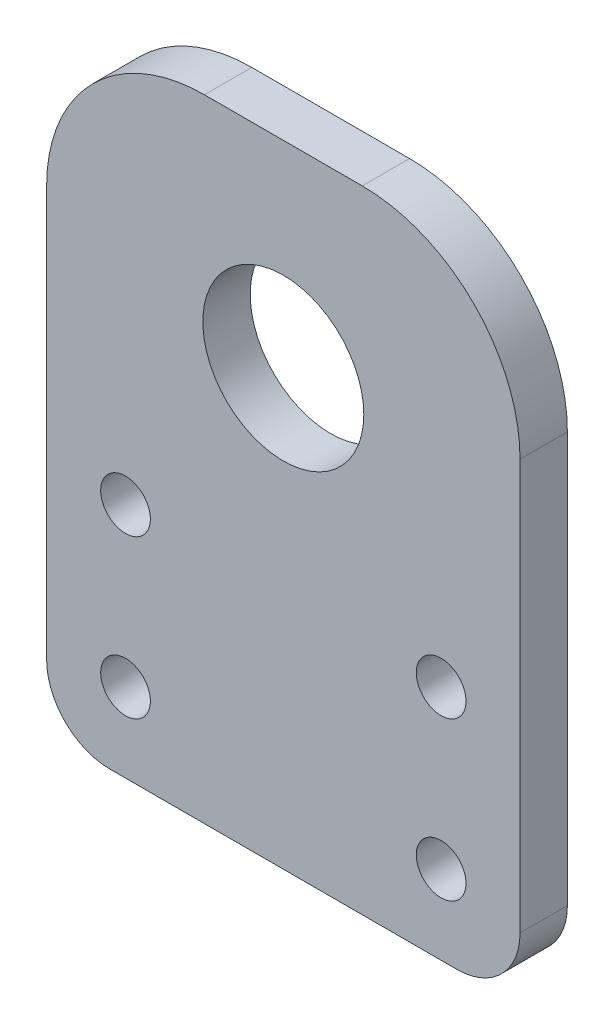
ISO-10303-21;
HEADER;
FILE_DESCRIPTION(('STEP AP214'),'2;1');
FILE_NAME('part.step','',(''),(''),'','','');
FILE_SCHEMA(('AUTOMOTIVE_DESIGN { 1 0 10303 214 1 1 1 1 }'));
ENDSEC;
DATA;
#1=APPLICATION_CONTEXT('core data for automotive mechanical design processes');
#2=APPLICATION_PROTOCOL_DEFINITION('international standard','automotive_design',2000,#1);
#3=PRODUCT_CONTEXT('',#1,'mechanical');
#4=PRODUCT('Part','Part','',(#3));
#5=PRODUCT_RELATED_PRODUCT_CATEGORY('part','',(#4));
#6=PRODUCT_DEFINITION_FORMATION('','',#4);
#7=PRODUCT_DEFINITION_CONTEXT('part definition',#1,'design');
#8=PRODUCT_DEFINITION('design','',#6,#7);
#9=PRODUCT_DEFINITION_SHAPE('','',#8);
#10=(LENGTH_UNIT() NAMED_UNIT(*) SI_UNIT(.MILLI.,.METRE.));
#11=(NAMED_UNIT(*) PLANE_ANGLE_UNIT() SI_UNIT($,.RADIAN.));
#12=(NAMED_UNIT(*) SI_UNIT($,.STERADIAN.) SOLID_ANGLE_UNIT());
#13=UNCERTAINTY_MEASURE_WITH_UNIT(LENGTH_MEASURE(1.E-05),#10,'distance_accuracy_value','');
#14=(GEOMETRIC_REPRESENTATION_CONTEXT(3) GLOBAL_UNCERTAINTY_ASSIGNED_CONTEXT((#13)) GLOBAL_UNIT_ASSIGNED_CONTEXT((#10,
#11,#12)) REPRESENTATION_CONTEXT('',''));
#15=CARTESIAN_POINT('',(0.,0.,0.));
#16=DIRECTION('',(0.,0.,1.));
#17=DIRECTION('',(1.,0.,0.));
#18=AXIS2_PLACEMENT_3D('',#15,#16,#17);
#19=CARTESIAN_POINT('',(0.,0.,3.));
#20=DIRECTION('',(1.,0.,0.));
#21=DIRECTION('',(0.,1.,0.));
#22=AXIS2_PLACEMENT_3D('',#19,#20,#21);
#23=PLANE('',#22);
#24=DIRECTION('',(0.,-1.,0.));
#25=VECTOR('',#24,1.);
#26=CARTESIAN_POINT('',(0.,0.,0.));
#27=LINE('',#26,#25);
#28=CARTESIAN_POINT('',(0.,-10.,0.));
#29=VERTEX_POINT('',#28);
#30=CARTESIAN_POINT('',(0.,-36.,0.));
#31=VERTEX_POINT('',#30);
#32=EDGE_CURVE('E201',#29,#31,#27,.T.);
#33=ORIENTED_EDGE('',*,*,#32,.T.);
#34=DIRECTION('',(0.,0.,-1.));
#35=VECTOR('',#34,1.);
#36=CARTESIAN_POINT('',(0.,-36.,3.));
#37=LINE('',#36,#35);
#38=CARTESIAN_POINT('',(0.,-36.,3.));
#39=VERTEX_POINT('',#38);
#40=EDGE_CURVE('E11',#31,#39,#37,.F.);
#41=ORIENTED_EDGE('',*,*,#40,.T.);
#42=DIRECTION('',(0.,-1.,0.));
#43=VECTOR('',#42,1.);
#44=CARTESIAN_POINT('',(0.,0.,3.));
#45=LINE('',#44,#43);
#46=CARTESIAN_POINT('',(0.,-10.,3.));
#47=VERTEX_POINT('',#46);
#48=EDGE_CURVE('E139',#47,#39,#45,.T.);
#49=ORIENTED_EDGE('',*,*,#48,.F.);
#50=DIRECTION('',(0.,0.,-1.));
#51=VECTOR('',#50,1.);
#52=CARTESIAN_POINT('',(0.,-10.,3.));
#53=LINE('',#52,#51);
#54=EDGE_CURVE('E162',#47,#29,#53,.T.);
#55=ORIENTED_EDGE('',*,*,#54,.T.);
#56=EDGE_LOOP('',(#33,#41,#49,#55));
#57=FACE_BOUND('',#56,.T.);
#58=ADVANCED_FACE('F43',(#57),#23,.F.);
#59=CARTESIAN_POINT('',(0.,-40.,3.));
#60=DIRECTION('',(0.,1.,0.));
#61=DIRECTION('',(0.,0.,1.));
#62=AXIS2_PLACEMENT_3D('',#59,#60,#61);
#63=PLANE('',#62);
#64=DIRECTION('',(1.,0.,0.));
#65=VECTOR('',#64,1.);
#66=CARTESIAN_POINT('',(0.,-40.,0.));
#67=LINE('',#66,#65);
#68=CARTESIAN_POINT('',(4.,-40.,0.));
#69=VERTEX_POINT('',#68);
#70=CARTESIAN_POINT('',(26.,-40.,0.));
#71=VERTEX_POINT('',#70);
#72=EDGE_CURVE('E146',#69,#71,#67,.T.);
#73=ORIENTED_EDGE('',*,*,#72,.T.);
#74=DIRECTION('',(0.,0.,-1.));
#75=VECTOR('',#74,1.);
#76=CARTESIAN_POINT('',(26.,-40.,3.));
#77=LINE('',#76,#75);
#78=CARTESIAN_POINT('',(26.,-40.,3.));
#79=VERTEX_POINT('',#78);
#80=EDGE_CURVE('E65',#71,#79,#77,.F.);
#81=ORIENTED_EDGE('',*,*,#80,.T.);
#82=DIRECTION('',(1.,0.,0.));
#83=VECTOR('',#82,1.);
#84=CARTESIAN_POINT('',(0.,-40.,3.));
#85=LINE('',#84,#83);
#86=CARTESIAN_POINT('',(4.,-40.,3.));
#87=VERTEX_POINT('',#86);
#88=EDGE_CURVE('E144',#87,#79,#85,.T.);
#89=ORIENTED_EDGE('',*,*,#88,.F.);
#90=DIRECTION('',(0.,0.,-1.));
#91=VECTOR('',#90,1.);
#92=CARTESIAN_POINT('',(4.,-40.,3.));
#93=LINE('',#92,#91);
#94=EDGE_CURVE('E176',#87,#69,#93,.T.);
#95=ORIENTED_EDGE('',*,*,#94,.T.);
#96=EDGE_LOOP('',(#73,#81,#89,#95));
#97=FACE_BOUND('',#96,.T.);
#98=ADVANCED_FACE('F198',(#97),#63,.F.);
#99=CARTESIAN_POINT('',(30.,0.,3.));
#100=DIRECTION('',(-1.,0.,0.));
#101=DIRECTION('',(0.,-1.,0.));
#102=AXIS2_PLACEMENT_3D('',#99,#100,#101);
#103=PLANE('',#102);
#104=DIRECTION('',(0.,1.,0.));
#105=VECTOR('',#104,1.);
#106=CARTESIAN_POINT('',(30.,0.,3.));
#107=LINE('',#106,#105);
#108=CARTESIAN_POINT('',(30.,-36.,3.));
#109=VERTEX_POINT('',#108);
#110=CARTESIAN_POINT('',(30.,-10.,3.));
#111=VERTEX_POINT('',#110);
#112=EDGE_CURVE('E189',#109,#111,#107,.T.);
#113=ORIENTED_EDGE('',*,*,#112,.F.);
#114=DIRECTION('',(0.,0.,-1.));
#115=VECTOR('',#114,1.);
#116=CARTESIAN_POINT('',(30.,-36.,3.));
#117=LINE('',#116,#115);
#118=CARTESIAN_POINT('',(30.,-36.,0.));
#119=VERTEX_POINT('',#118);
#120=EDGE_CURVE('E166',#109,#119,#117,.T.);
#121=ORIENTED_EDGE('',*,*,#120,.T.);
#122=DIRECTION('',(0.,1.,0.));
#123=VECTOR('',#122,1.);
#124=CARTESIAN_POINT('',(30.,0.,0.));
#125=LINE('',#124,#123);
#126=CARTESIAN_POINT('',(30.,-10.,0.));
#127=VERTEX_POINT('',#126);
#128=EDGE_CURVE('E140',#119,#127,#125,.T.);
#129=ORIENTED_EDGE('',*,*,#128,.T.);
#130=DIRECTION('',(0.,0.,-1.));
#131=VECTOR('',#130,1.);
#132=CARTESIAN_POINT('',(30.,-10.,3.));
#133=LINE('',#132,#131);
#134=EDGE_CURVE('E118',#127,#111,#133,.F.);
#135=ORIENTED_EDGE('',*,*,#134,.T.);
#136=EDGE_LOOP('',(#113,#121,#129,#135));
#137=FACE_BOUND('',#136,.T.);
#138=ADVANCED_FACE('F193',(#137),#103,.F.);
#139=CARTESIAN_POINT('',(0.,0.,3.));
#140=DIRECTION('',(0.,-1.,0.));
#141=DIRECTION('',(0.,0.,-1.));
#142=AXIS2_PLACEMENT_3D('',#139,#140,#141);
#143=PLANE('',#142);
#144=DIRECTION('',(-1.,0.,0.));
#145=VECTOR('',#144,1.);
#146=CARTESIAN_POINT('',(0.,0.,3.));
#147=LINE('',#146,#145);
#148=CARTESIAN_POINT('',(20.,0.,3.));
#149=VERTEX_POINT('',#148);
#150=CARTESIAN_POINT('',(10.,0.,3.));
#151=VERTEX_POINT('',#150);
#152=EDGE_CURVE('E132',#149,#151,#147,.T.);
#153=ORIENTED_EDGE('',*,*,#152,.F.);
#154=DIRECTION('',(0.,0.,-1.));
#155=VECTOR('',#154,1.);
#156=CARTESIAN_POINT('',(20.,0.,3.));
#157=LINE('',#156,#155);
#158=CARTESIAN_POINT('',(20.,0.,0.));
#159=VERTEX_POINT('',#158);
#160=EDGE_CURVE('E116',#149,#159,#157,.T.);
#161=ORIENTED_EDGE('',*,*,#160,.T.);
#162=DIRECTION('',(-1.,0.,0.));
#163=VECTOR('',#162,1.);
#164=CARTESIAN_POINT('',(0.,0.,0.));
#165=LINE('',#164,#163);
#166=CARTESIAN_POINT('',(10.,0.,0.));
#167=VERTEX_POINT('',#166);
#168=EDGE_CURVE('E129',#159,#167,#165,.T.);
#169=ORIENTED_EDGE('',*,*,#168,.T.);
#170=DIRECTION('',(0.,0.,-1.));
#171=VECTOR('',#170,1.);
#172=CARTESIAN_POINT('',(10.,0.,3.));
#173=LINE('',#172,#171);
#174=EDGE_CURVE('E134',#167,#151,#173,.F.);
#175=ORIENTED_EDGE('',*,*,#174,.T.);
#176=EDGE_LOOP('',(#153,#161,#169,#175));
#177=FACE_BOUND('',#176,.T.);
#178=ADVANCED_FACE('F128',(#177),#143,.F.);
#179=CARTESIAN_POINT('',(0.,0.,3.));
#180=DIRECTION('',(0.,0.,1.));
#181=DIRECTION('',(1.,0.,0.));
#182=AXIS2_PLACEMENT_3D('',#179,#180,#181);
#183=PLANE('',#182);
#184=CARTESIAN_POINT('',(15.,-12.5,3.));
#185=DIRECTION('',(0.,0.,1.));
#186=DIRECTION('',(1.,0.,0.));
#187=AXIS2_PLACEMENT_3D('',#184,#185,#186);
#188=CIRCLE('',#187,5.1);
#189=CARTESIAN_POINT('',(20.1,-12.5,3.));
#190=VERTEX_POINT('',#189);
#191=EDGE_CURVE('E242',#190,#190,#188,.T.);
#192=ORIENTED_EDGE('',*,*,#191,.F.);
#193=EDGE_LOOP('',(#192));
#194=FACE_BOUND('',#193,.T.);
#195=CARTESIAN_POINT('',(5.,-25.,3.));
#196=DIRECTION('',(0.,0.,1.));
#197=DIRECTION('',(1.,0.,0.));
#198=AXIS2_PLACEMENT_3D('',#195,#196,#197);
#199=CIRCLE('',#198,1.575);
#200=CARTESIAN_POINT('',(6.575,-25.,3.));
#201=VERTEX_POINT('',#200);
#202=EDGE_CURVE('E238',#201,#201,#199,.T.);
#203=ORIENTED_EDGE('',*,*,#202,.F.);
#204=EDGE_LOOP('',(#203));
#205=FACE_BOUND('',#204,.T.);
#206=CARTESIAN_POINT('',(5.,-35.,3.));
#207=DIRECTION('',(0.,0.,1.));
#208=DIRECTION('',(-1.,0.,0.));
#209=AXIS2_PLACEMENT_3D('',#206,#207,#208);
#210=CIRCLE('',#209,1.575);
#211=CARTESIAN_POINT('',(3.42500000000001,-35.,3.));
#212=VERTEX_POINT('',#211);
#213=EDGE_CURVE('E230',#212,#212,#210,.T.);
#214=ORIENTED_EDGE('',*,*,#213,.F.);
#215=EDGE_LOOP('',(#214));
#216=FACE_BOUND('',#215,.T.);
#217=CARTESIAN_POINT('',(25.,-35.,3.));
#218=DIRECTION('',(0.,0.,1.));
#219=DIRECTION('',(1.,0.,0.));
#220=AXIS2_PLACEMENT_3D('',#217,#218,#219);
#221=CIRCLE('',#220,1.575);
#222=CARTESIAN_POINT('',(26.575,-35.,3.));
#223=VERTEX_POINT('',#222);
#224=EDGE_CURVE('E222',#223,#223,#221,.T.);
#225=ORIENTED_EDGE('',*,*,#224,.F.);
#226=EDGE_LOOP('',(#225));
#227=FACE_BOUND('',#226,.T.);
#228=CARTESIAN_POINT('',(25.,-25.,3.));
#229=DIRECTION('',(0.,0.,1.));
#230=DIRECTION('',(-1.,0.,0.));
#231=AXIS2_PLACEMENT_3D('',#228,#229,#230);
#232=CIRCLE('',#231,1.575);
#233=CARTESIAN_POINT('',(23.425,-25.,3.));
#234=VERTEX_POINT('',#233);
#235=EDGE_CURVE('E214',#234,#234,#232,.T.);
#236=ORIENTED_EDGE('',*,*,#235,.F.);
#237=EDGE_LOOP('',(#236));
#238=FACE_BOUND('',#237,.T.);
#239=ORIENTED_EDGE('',*,*,#88,.T.);
#240=CARTESIAN_POINT('',(26.,-36.,3.));
#241=DIRECTION('',(0.,0.,1.));
#242=DIRECTION('',(1.,0.,0.));
#243=AXIS2_PLACEMENT_3D('',#240,#241,#242);
#244=CIRCLE('',#243,4.);
#245=EDGE_CURVE('E52',#79,#109,#244,.T.);
#246=ORIENTED_EDGE('',*,*,#245,.T.);
#247=ORIENTED_EDGE('',*,*,#112,.T.);
#248=CARTESIAN_POINT('',(20.,-10.,3.));
#249=DIRECTION('',(0.,0.,1.));
#250=DIRECTION('',(1.,0.,0.));
#251=AXIS2_PLACEMENT_3D('',#248,#249,#250);
#252=CIRCLE('',#251,10.);
#253=EDGE_CURVE('E159',#111,#149,#252,.T.);
#254=ORIENTED_EDGE('',*,*,#253,.T.);
#255=ORIENTED_EDGE('',*,*,#152,.T.);
#256=CARTESIAN_POINT('',(10.,-10.,3.));
#257=DIRECTION('',(0.,0.,1.));
#258=DIRECTION('',(1.,0.,0.));
#259=AXIS2_PLACEMENT_3D('',#256,#257,#258);
#260=CIRCLE('',#259,10.);
#261=EDGE_CURVE('E156',#151,#47,#260,.T.);
#262=ORIENTED_EDGE('',*,*,#261,.T.);
#263=ORIENTED_EDGE('',*,*,#48,.T.);
#264=CARTESIAN_POINT('',(4.,-36.,3.));
#265=DIRECTION('',(0.,0.,1.));
#266=DIRECTION('',(1.,0.,0.));
#267=AXIS2_PLACEMENT_3D('',#264,#265,#266);
#268=CIRCLE('',#267,4.);
#269=EDGE_CURVE('E182',#39,#87,#268,.T.);
#270=ORIENTED_EDGE('',*,*,#269,.T.);
#271=EDGE_LOOP('',(#239,#246,#247,#254,#255,#262,#263,#270));
#272=FACE_BOUND('',#271,.T.);
#273=ADVANCED_FACE('F188',(#194,#205,#216,#227,#238,#272),#183,.T.);
#274=CARTESIAN_POINT('',(0.,0.,0.));
#275=DIRECTION('',(0.,0.,1.));
#276=DIRECTION('',(1.,0.,0.));
#277=AXIS2_PLACEMENT_3D('',#274,#275,#276);
#278=PLANE('',#277);
#279=CARTESIAN_POINT('',(15.,-12.5,0.));
#280=DIRECTION('',(0.,0.,1.));
#281=DIRECTION('',(1.,0.,0.));
#282=AXIS2_PLACEMENT_3D('',#279,#280,#281);
#283=CIRCLE('',#282,5.1);
#284=CARTESIAN_POINT('',(20.1,-12.5,0.));
#285=VERTEX_POINT('',#284);
#286=EDGE_CURVE('E203',#285,#285,#283,.T.);
#287=ORIENTED_EDGE('',*,*,#286,.T.);
#288=EDGE_LOOP('',(#287));
#289=FACE_BOUND('',#288,.T.);
#290=CARTESIAN_POINT('',(5.,-25.,0.));
#291=DIRECTION('',(0.,0.,1.));
#292=DIRECTION('',(1.,0.,0.));
#293=AXIS2_PLACEMENT_3D('',#290,#291,#292);
#294=CIRCLE('',#293,1.575);
#295=CARTESIAN_POINT('',(6.575,-25.,0.));
#296=VERTEX_POINT('',#295);
#297=EDGE_CURVE('E234',#296,#296,#294,.T.);
#298=ORIENTED_EDGE('',*,*,#297,.T.);
#299=EDGE_LOOP('',(#298));
#300=FACE_BOUND('',#299,.T.);
#301=CARTESIAN_POINT('',(5.,-35.,0.));
#302=DIRECTION('',(0.,0.,1.));
#303=DIRECTION('',(-1.,0.,0.));
#304=AXIS2_PLACEMENT_3D('',#301,#302,#303);
#305=CIRCLE('',#304,1.575);
#306=CARTESIAN_POINT('',(3.42500000000001,-35.,0.));
#307=VERTEX_POINT('',#306);
#308=EDGE_CURVE('E226',#307,#307,#305,.T.);
#309=ORIENTED_EDGE('',*,*,#308,.T.);
#310=EDGE_LOOP('',(#309));
#311=FACE_BOUND('',#310,.T.);
#312=CARTESIAN_POINT('',(25.,-35.,0.));
#313=DIRECTION('',(0.,0.,1.));
#314=DIRECTION('',(1.,0.,0.));
#315=AXIS2_PLACEMENT_3D('',#312,#313,#314);
#316=CIRCLE('',#315,1.575);
#317=CARTESIAN_POINT('',(26.575,-35.,0.));
#318=VERTEX_POINT('',#317);
#319=EDGE_CURVE('E218',#318,#318,#316,.T.);
#320=ORIENTED_EDGE('',*,*,#319,.T.);
#321=EDGE_LOOP('',(#320));
#322=FACE_BOUND('',#321,.T.);
#323=CARTESIAN_POINT('',(25.,-25.,0.));
#324=DIRECTION('',(0.,0.,1.));
#325=DIRECTION('',(-1.,0.,0.));
#326=AXIS2_PLACEMENT_3D('',#323,#324,#325);
#327=CIRCLE('',#326,1.575);
#328=CARTESIAN_POINT('',(23.425,-25.,0.));
#329=VERTEX_POINT('',#328);
#330=EDGE_CURVE('E210',#329,#329,#327,.T.);
#331=ORIENTED_EDGE('',*,*,#330,.T.);
#332=EDGE_LOOP('',(#331));
#333=FACE_BOUND('',#332,.T.);
#334=ORIENTED_EDGE('',*,*,#128,.F.);
#335=CARTESIAN_POINT('',(26.,-36.,0.));
#336=DIRECTION('',(0.,0.,1.));
#337=DIRECTION('',(1.,0.,0.));
#338=AXIS2_PLACEMENT_3D('',#335,#336,#337);
#339=CIRCLE('',#338,4.);
#340=EDGE_CURVE('E173',#119,#71,#339,.F.);
#341=ORIENTED_EDGE('',*,*,#340,.T.);
#342=ORIENTED_EDGE('',*,*,#72,.F.);
#343=CARTESIAN_POINT('',(4.,-36.,0.));
#344=DIRECTION('',(0.,0.,1.));
#345=DIRECTION('',(1.,0.,0.));
#346=AXIS2_PLACEMENT_3D('',#343,#344,#345);
#347=CIRCLE('',#346,4.);
#348=EDGE_CURVE('E170',#69,#31,#347,.F.);
#349=ORIENTED_EDGE('',*,*,#348,.T.);
#350=ORIENTED_EDGE('',*,*,#32,.F.);
#351=CARTESIAN_POINT('',(10.,-10.,0.));
#352=DIRECTION('',(0.,0.,1.));
#353=DIRECTION('',(1.,0.,0.));
#354=AXIS2_PLACEMENT_3D('',#351,#352,#353);
#355=CIRCLE('',#354,10.);
#356=EDGE_CURVE('E123',#29,#167,#355,.F.);
#357=ORIENTED_EDGE('',*,*,#356,.T.);
#358=ORIENTED_EDGE('',*,*,#168,.F.);
#359=CARTESIAN_POINT('',(20.,-10.,0.));
#360=DIRECTION('',(0.,0.,1.));
#361=DIRECTION('',(1.,0.,0.));
#362=AXIS2_PLACEMENT_3D('',#359,#360,#361);
#363=CIRCLE('',#362,10.);
#364=EDGE_CURVE('E112',#159,#127,#363,.F.);
#365=ORIENTED_EDGE('',*,*,#364,.T.);
#366=EDGE_LOOP('',(#334,#341,#342,#349,#350,#357,#358,#365));
#367=FACE_BOUND('',#366,.T.);
#368=ADVANCED_FACE('F136',(#289,#300,#311,#322,#333,#367),#278,.F.);
#369=CARTESIAN_POINT('',(25.,-25.,0.));
#370=DIRECTION('',(0.,0.,1.));
#371=DIRECTION('',(1.,0.,0.));
#372=AXIS2_PLACEMENT_3D('',#369,#370,#371);
#373=CYLINDRICAL_SURFACE('',#372,1.575);
#374=ORIENTED_EDGE('',*,*,#330,.F.);
#375=EDGE_LOOP('',(#374));
#376=FACE_BOUND('',#375,.T.);
#377=ORIENTED_EDGE('',*,*,#235,.T.);
#378=EDGE_LOOP('',(#377));
#379=FACE_BOUND('',#378,.T.);
#380=ADVANCED_FACE('F270',(#376,#379),#373,.F.);
#381=CARTESIAN_POINT('',(25.,-35.,0.));
#382=DIRECTION('',(0.,0.,1.));
#383=DIRECTION('',(1.,0.,0.));
#384=AXIS2_PLACEMENT_3D('',#381,#382,#383);
#385=CYLINDRICAL_SURFACE('',#384,1.575);
#386=ORIENTED_EDGE('',*,*,#319,.F.);
#387=EDGE_LOOP('',(#386));
#388=FACE_BOUND('',#387,.T.);
#389=ORIENTED_EDGE('',*,*,#224,.T.);
#390=EDGE_LOOP('',(#389));
#391=FACE_BOUND('',#390,.T.);
#392=ADVANCED_FACE('F272',(#388,#391),#385,.F.);
#393=CARTESIAN_POINT('',(5.,-35.,0.));
#394=DIRECTION('',(0.,0.,1.));
#395=DIRECTION('',(1.,0.,0.));
#396=AXIS2_PLACEMENT_3D('',#393,#394,#395);
#397=CYLINDRICAL_SURFACE('',#396,1.575);
#398=ORIENTED_EDGE('',*,*,#308,.F.);
#399=EDGE_LOOP('',(#398));
#400=FACE_BOUND('',#399,.T.);
#401=ORIENTED_EDGE('',*,*,#213,.T.);
#402=EDGE_LOOP('',(#401));
#403=FACE_BOUND('',#402,.T.);
#404=ADVANCED_FACE('F279',(#400,#403),#397,.F.);
#405=CARTESIAN_POINT('',(5.,-25.,0.));
#406=DIRECTION('',(0.,0.,1.));
#407=DIRECTION('',(1.,0.,0.));
#408=AXIS2_PLACEMENT_3D('',#405,#406,#407);
#409=CYLINDRICAL_SURFACE('',#408,1.575);
#410=ORIENTED_EDGE('',*,*,#297,.F.);
#411=EDGE_LOOP('',(#410));
#412=FACE_BOUND('',#411,.T.);
#413=ORIENTED_EDGE('',*,*,#202,.T.);
#414=EDGE_LOOP('',(#413));
#415=FACE_BOUND('',#414,.T.);
#416=ADVANCED_FACE('F255',(#412,#415),#409,.F.);
#417=CARTESIAN_POINT('',(15.,-12.5,0.));
#418=DIRECTION('',(0.,0.,1.));
#419=DIRECTION('',(1.,0.,0.));
#420=AXIS2_PLACEMENT_3D('',#417,#418,#419);
#421=CYLINDRICAL_SURFACE('',#420,5.1);
#422=ORIENTED_EDGE('',*,*,#286,.F.);
#423=EDGE_LOOP('',(#422));
#424=FACE_BOUND('',#423,.T.);
#425=ORIENTED_EDGE('',*,*,#191,.T.);
#426=EDGE_LOOP('',(#425));
#427=FACE_BOUND('',#426,.T.);
#428=ADVANCED_FACE('F252',(#424,#427),#421,.F.);
#429=CARTESIAN_POINT('',(20.,-10.,3.));
#430=DIRECTION('',(0.,0.,-1.));
#431=DIRECTION('',(-1.,0.,0.));
#432=AXIS2_PLACEMENT_3D('',#429,#430,#431);
#433=CYLINDRICAL_SURFACE('',#432,10.);
#434=ORIENTED_EDGE('',*,*,#253,.F.);
#435=ORIENTED_EDGE('',*,*,#134,.F.);
#436=ORIENTED_EDGE('',*,*,#364,.F.);
#437=ORIENTED_EDGE('',*,*,#160,.F.);
#438=EDGE_LOOP('',(#434,#435,#436,#437));
#439=FACE_BOUND('',#438,.T.);
#440=ADVANCED_FACE('F115',(#439),#433,.T.);
#441=CARTESIAN_POINT('',(10.,-10.,3.));
#442=DIRECTION('',(0.,0.,-1.));
#443=DIRECTION('',(-1.,0.,0.));
#444=AXIS2_PLACEMENT_3D('',#441,#442,#443);
#445=CYLINDRICAL_SURFACE('',#444,10.);
#446=ORIENTED_EDGE('',*,*,#261,.F.);
#447=ORIENTED_EDGE('',*,*,#174,.F.);
#448=ORIENTED_EDGE('',*,*,#356,.F.);
#449=ORIENTED_EDGE('',*,*,#54,.F.);
#450=EDGE_LOOP('',(#446,#447,#448,#449));
#451=FACE_BOUND('',#450,.T.);
#452=ADVANCED_FACE('F294',(#451),#445,.T.);
#453=CARTESIAN_POINT('',(26.,-36.,3.));
#454=DIRECTION('',(0.,0.,-1.));
#455=DIRECTION('',(-1.,0.,0.));
#456=AXIS2_PLACEMENT_3D('',#453,#454,#455);
#457=CYLINDRICAL_SURFACE('',#456,4.);
#458=ORIENTED_EDGE('',*,*,#245,.F.);
#459=ORIENTED_EDGE('',*,*,#80,.F.);
#460=ORIENTED_EDGE('',*,*,#340,.F.);
#461=ORIENTED_EDGE('',*,*,#120,.F.);
#462=EDGE_LOOP('',(#458,#459,#460,#461));
#463=FACE_BOUND('',#462,.T.);
#464=ADVANCED_FACE('F196',(#463),#457,.T.);
#465=CARTESIAN_POINT('',(4.,-36.,3.));
#466=DIRECTION('',(0.,0.,-1.));
#467=DIRECTION('',(-1.,0.,0.));
#468=AXIS2_PLACEMENT_3D('',#465,#466,#467);
#469=CYLINDRICAL_SURFACE('',#468,4.);
#470=ORIENTED_EDGE('',*,*,#269,.F.);
#471=ORIENTED_EDGE('',*,*,#40,.F.);
#472=ORIENTED_EDGE('',*,*,#348,.F.);
#473=ORIENTED_EDGE('',*,*,#94,.F.);
#474=EDGE_LOOP('',(#470,#471,#472,#473));
#475=FACE_BOUND('',#474,.T.);
#476=ADVANCED_FACE('F45',(#475),#469,.T.);
#477=CLOSED_SHELL('',(#58,#98,#138,#178,#273,#368,#380,#392,#404,#416,#428,#440,#452,#464,#476));
#478=MANIFOLD_SOLID_BREP('B2',#477);
#479=ADVANCED_BREP_SHAPE_REPRESENTATION('',(#18,#478),#14);
#480=SHAPE_DEFINITION_REPRESENTATION(#9,#479);
ENDSEC;
END-ISO-10303-21;
